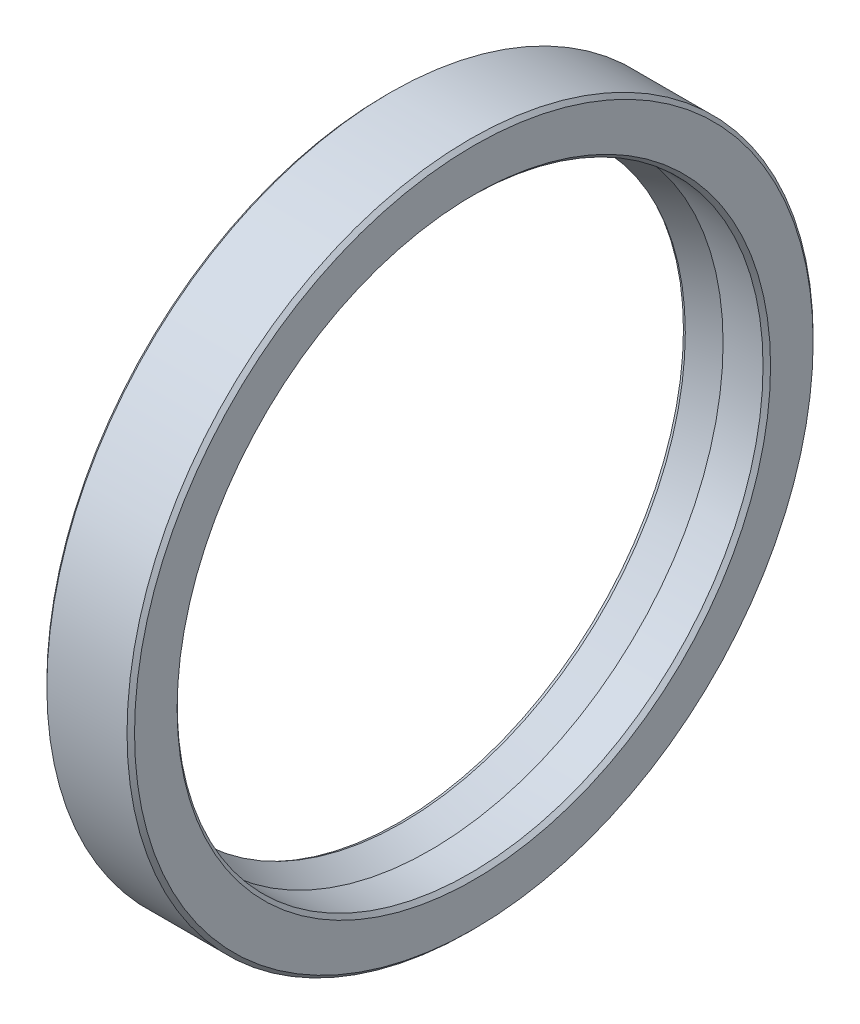
ISO-10303-21;
HEADER;
FILE_DESCRIPTION(('STEP AP214'),'2;1');
FILE_NAME('part.step','',(''),(''),'','','');
FILE_SCHEMA(('AUTOMOTIVE_DESIGN { 1 0 10303 214 1 1 1 1 }'));
ENDSEC;
DATA;
#1=APPLICATION_CONTEXT('core data for automotive mechanical design processes');
#2=APPLICATION_PROTOCOL_DEFINITION('international standard','automotive_design',2000,#1);
#3=PRODUCT_CONTEXT('',#1,'mechanical');
#4=PRODUCT('Part','Part','',(#3));
#5=PRODUCT_RELATED_PRODUCT_CATEGORY('part','',(#4));
#6=PRODUCT_DEFINITION_FORMATION('','',#4);
#7=PRODUCT_DEFINITION_CONTEXT('part definition',#1,'design');
#8=PRODUCT_DEFINITION('design','',#6,#7);
#9=PRODUCT_DEFINITION_SHAPE('','',#8);
#10=(LENGTH_UNIT() NAMED_UNIT(*) SI_UNIT(.MILLI.,.METRE.));
#11=(NAMED_UNIT(*) PLANE_ANGLE_UNIT() SI_UNIT($,.RADIAN.));
#12=(NAMED_UNIT(*) SI_UNIT($,.STERADIAN.) SOLID_ANGLE_UNIT());
#13=UNCERTAINTY_MEASURE_WITH_UNIT(LENGTH_MEASURE(1.E-05),#10,'distance_accuracy_value','');
#14=(GEOMETRIC_REPRESENTATION_CONTEXT(3) GLOBAL_UNCERTAINTY_ASSIGNED_CONTEXT((#13)) GLOBAL_UNIT_ASSIGNED_CONTEXT((#10,
#11,#12)) REPRESENTATION_CONTEXT('',''));
#15=CARTESIAN_POINT('',(0.,0.,0.));
#16=DIRECTION('',(0.,0.,1.));
#17=DIRECTION('',(1.,0.,0.));
#18=AXIS2_PLACEMENT_3D('',#15,#16,#17);
#19=CARTESIAN_POINT('',(4.,-27.3897415989074,0.));
#20=DIRECTION('',(1.,0.,0.));
#21=DIRECTION('',(0.,0.,-1.));
#22=AXIS2_PLACEMENT_3D('',#19,#20,#21);
#23=TOROIDAL_SURFACE('',#22,25.3897415989074,0.75);
#24=CARTESIAN_POINT('',(4.27711738402882,-27.3897415989074,0.));
#25=DIRECTION('',(1.,0.,0.));
#26=DIRECTION('',(0.,0.,-1.));
#27=AXIS2_PLACEMENT_3D('',#24,#25,#26);
#28=CIRCLE('',#27,24.6928155228641);
#29=CARTESIAN_POINT('',(4.27711738402882,-27.3897415989074,-24.6928155228641));
#30=VERTEX_POINT('',#29);
#31=EDGE_CURVE('E10',#30,#30,#28,.T.);
#32=ORIENTED_EDGE('',*,*,#31,.T.);
#33=EDGE_LOOP('',(#32));
#34=FACE_BOUND('',#33,.T.);
#35=CARTESIAN_POINT('',(4.04651405963486,-27.3897415989074,0.));
#36=DIRECTION('',(1.,0.,0.));
#37=DIRECTION('',(0.,0.,-1.));
#38=AXIS2_PLACEMENT_3D('',#35,#36,#37);
#39=CIRCLE('',#38,26.1382978374468);
#40=CARTESIAN_POINT('',(4.04651405963486,-27.3897415989074,-26.1382978374468));
#41=VERTEX_POINT('',#40);
#42=EDGE_CURVE('E85',#41,#41,#39,.T.);
#43=ORIENTED_EDGE('',*,*,#42,.F.);
#44=EDGE_LOOP('',(#43));
#45=FACE_BOUND('',#44,.T.);
#46=ADVANCED_FACE('F39',(#34,#45),#23,.F.);
#47=CARTESIAN_POINT('',(4.27711738402882,-27.3897415989074,0.));
#48=DIRECTION('',(1.,0.,0.));
#49=DIRECTION('',(0.,0.,-1.));
#50=AXIS2_PLACEMENT_3D('',#47,#48,#49);
#51=CONICAL_SURFACE('',#50,24.6928155228641,0.378459955629821);
#52=CARTESIAN_POINT('',(1.31525507731412,-27.3897415989074,0.));
#53=DIRECTION('',(1.,0.,0.));
#54=DIRECTION('',(0.,0.,-1.));
#55=AXIS2_PLACEMENT_3D('',#52,#53,#54);
#56=CIRCLE('',#55,23.5150958729548);
#57=CARTESIAN_POINT('',(1.31525507731412,-27.3897415989074,-23.5150958729548));
#58=VERTEX_POINT('',#57);
#59=EDGE_CURVE('E45',#58,#58,#56,.T.);
#60=ORIENTED_EDGE('',*,*,#59,.T.);
#61=EDGE_LOOP('',(#60));
#62=FACE_BOUND('',#61,.T.);
#63=ORIENTED_EDGE('',*,*,#31,.F.);
#64=EDGE_LOOP('',(#63));
#65=FACE_BOUND('',#64,.T.);
#66=ADVANCED_FACE('F93',(#62,#65),#51,.T.);
#67=CARTESIAN_POINT('',(1.5,-27.3897415989074,0.));
#68=DIRECTION('',(1.,0.,0.));
#69=DIRECTION('',(0.,0.,-1.));
#70=AXIS2_PLACEMENT_3D('',#67,#68,#69);
#71=TOROIDAL_SURFACE('',#70,23.0504784889259,0.5);
#72=CARTESIAN_POINT('',(1.,-27.3897415989074,0.));
#73=DIRECTION('',(1.,0.,0.));
#74=DIRECTION('',(0.,0.,-1.));
#75=AXIS2_PLACEMENT_3D('',#72,#73,#74);
#76=CIRCLE('',#75,23.0504784889259);
#77=CARTESIAN_POINT('',(1.,-27.3897415989074,-23.0504784889259));
#78=VERTEX_POINT('',#77);
#79=EDGE_CURVE('E49',#78,#78,#76,.T.);
#80=ORIENTED_EDGE('',*,*,#79,.T.);
#81=EDGE_LOOP('',(#80));
#82=FACE_BOUND('',#81,.T.);
#83=ORIENTED_EDGE('',*,*,#59,.F.);
#84=EDGE_LOOP('',(#83));
#85=FACE_BOUND('',#84,.T.);
#86=ADVANCED_FACE('F97',(#82,#85),#71,.T.);
#87=CARTESIAN_POINT('',(1.,-4.33926310998144,0.));
#88=DIRECTION('',(-1.,0.,0.));
#89=DIRECTION('',(0.,0.,1.));
#90=AXIS2_PLACEMENT_3D('',#87,#88,#89);
#91=PLANE('',#90);
#92=CARTESIAN_POINT('',(1.,-27.3897415989074,0.));
#93=DIRECTION('',(1.,0.,0.));
#94=DIRECTION('',(0.,0.,-1.));
#95=AXIS2_PLACEMENT_3D('',#92,#93,#94);
#96=CIRCLE('',#95,22.7347226406222);
#97=CARTESIAN_POINT('',(1.,-27.3897415989074,-22.7347226406222));
#98=VERTEX_POINT('',#97);
#99=EDGE_CURVE('E53',#98,#98,#96,.T.);
#100=ORIENTED_EDGE('',*,*,#99,.T.);
#101=EDGE_LOOP('',(#100));
#102=FACE_BOUND('',#101,.T.);
#103=ORIENTED_EDGE('',*,*,#79,.F.);
#104=EDGE_LOOP('',(#103));
#105=FACE_BOUND('',#104,.T.);
#106=ADVANCED_FACE('F101',(#102,#105),#91,.T.);
#107=CARTESIAN_POINT('',(1.,-27.3897415989074,0.));
#108=DIRECTION('',(-1.,0.,0.));
#109=DIRECTION('',(0.,0.,1.));
#110=AXIS2_PLACEMENT_3D('',#107,#108,#109);
#111=CONICAL_SURFACE('',#110,22.7347226406222,0.444647520399419);
#112=CARTESIAN_POINT('',(1.28275122105899,-27.3897415989074,0.));
#113=DIRECTION('',(1.,0.,0.));
#114=DIRECTION('',(0.,0.,-1.));
#115=AXIS2_PLACEMENT_3D('',#112,#113,#114);
#116=CIRCLE('',#115,22.6);
#117=CARTESIAN_POINT('',(1.28275122105899,-27.3897415989074,-22.6));
#118=VERTEX_POINT('',#117);
#119=EDGE_CURVE('E58',#118,#118,#116,.T.);
#120=ORIENTED_EDGE('',*,*,#119,.T.);
#121=EDGE_LOOP('',(#120));
#122=FACE_BOUND('',#121,.T.);
#123=ORIENTED_EDGE('',*,*,#99,.F.);
#124=EDGE_LOOP('',(#123));
#125=FACE_BOUND('',#124,.T.);
#126=ADVANCED_FACE('F108',(#122,#125),#111,.F.);
#127=CARTESIAN_POINT('',(1.28275122105899,-27.3897415989074,0.));
#128=DIRECTION('',(1.,0.,0.));
#129=DIRECTION('',(0.,0.,-1.));
#130=AXIS2_PLACEMENT_3D('',#127,#128,#129);
#131=CONICAL_SURFACE('',#130,22.6,0.340750642998034);
#132=CARTESIAN_POINT('',(3.51,-27.3897415989074,0.));
#133=DIRECTION('',(1.,0.,0.));
#134=DIRECTION('',(0.,0.,-1.));
#135=AXIS2_PLACEMENT_3D('',#132,#133,#134);
#136=CIRCLE('',#135,23.3897415989074);
#137=CARTESIAN_POINT('',(3.51,-27.3897415989074,-23.3897415989074));
#138=VERTEX_POINT('',#137);
#139=EDGE_CURVE('E61',#138,#138,#136,.T.);
#140=ORIENTED_EDGE('',*,*,#139,.T.);
#141=EDGE_LOOP('',(#140));
#142=FACE_BOUND('',#141,.T.);
#143=ORIENTED_EDGE('',*,*,#119,.F.);
#144=EDGE_LOOP('',(#143));
#145=FACE_BOUND('',#144,.T.);
#146=ADVANCED_FACE('F112',(#142,#145),#131,.F.);
#147=CARTESIAN_POINT('',(1.28275122105899,-27.3897415989074,0.));
#148=DIRECTION('',(1.,0.,0.));
#149=DIRECTION('',(0.,0.,-1.));
#150=AXIS2_PLACEMENT_3D('',#147,#148,#149);
#151=CYLINDRICAL_SURFACE('',#150,23.3897415989074);
#152=CARTESIAN_POINT('',(6.7,-27.3897415989074,0.));
#153=DIRECTION('',(1.,0.,0.));
#154=DIRECTION('',(0.,0.,-1.));
#155=AXIS2_PLACEMENT_3D('',#152,#153,#154);
#156=CIRCLE('',#155,23.3897415989074);
#157=CARTESIAN_POINT('',(6.7,-27.3897415989074,-23.3897415989074));
#158=VERTEX_POINT('',#157);
#159=EDGE_CURVE('E64',#158,#158,#156,.T.);
#160=ORIENTED_EDGE('',*,*,#159,.T.);
#161=EDGE_LOOP('',(#160));
#162=FACE_BOUND('',#161,.T.);
#163=ORIENTED_EDGE('',*,*,#139,.F.);
#164=EDGE_LOOP('',(#163));
#165=FACE_BOUND('',#164,.T.);
#166=ADVANCED_FACE('F116',(#162,#165),#151,.F.);
#167=CARTESIAN_POINT('',(6.7,-27.3897415989074,0.));
#168=DIRECTION('',(1.,0.,0.));
#169=DIRECTION('',(0.,0.,-1.));
#170=AXIS2_PLACEMENT_3D('',#167,#168,#169);
#171=CONICAL_SURFACE('',#170,23.3897415989074,0.785398163397451);
#172=CARTESIAN_POINT('',(7.,-27.3897415989074,0.));
#173=DIRECTION('',(1.,0.,0.));
#174=DIRECTION('',(0.,0.,-1.));
#175=AXIS2_PLACEMENT_3D('',#172,#173,#174);
#176=CIRCLE('',#175,23.6897415989074);
#177=CARTESIAN_POINT('',(7.,-27.3897415989074,-23.6897415989074));
#178=VERTEX_POINT('',#177);
#179=EDGE_CURVE('E67',#178,#178,#176,.T.);
#180=ORIENTED_EDGE('',*,*,#179,.T.);
#181=EDGE_LOOP('',(#180));
#182=FACE_BOUND('',#181,.T.);
#183=ORIENTED_EDGE('',*,*,#159,.F.);
#184=EDGE_LOOP('',(#183));
#185=FACE_BOUND('',#184,.T.);
#186=ADVANCED_FACE('F120',(#182,#185),#171,.F.);
#187=CARTESIAN_POINT('',(7.,-0.299999999999999,0.));
#188=DIRECTION('',(1.,0.,0.));
#189=DIRECTION('',(0.,0.,-1.));
#190=AXIS2_PLACEMENT_3D('',#187,#188,#189);
#191=PLANE('',#190);
#192=CARTESIAN_POINT('',(7.,-27.3897415989074,0.));
#193=DIRECTION('',(1.,0.,0.));
#194=DIRECTION('',(0.,0.,-1.));
#195=AXIS2_PLACEMENT_3D('',#192,#193,#194);
#196=CIRCLE('',#195,27.0897415989074);
#197=CARTESIAN_POINT('',(7.,-27.3897415989074,-27.0897415989074));
#198=VERTEX_POINT('',#197);
#199=EDGE_CURVE('E70',#198,#198,#196,.T.);
#200=ORIENTED_EDGE('',*,*,#199,.T.);
#201=EDGE_LOOP('',(#200));
#202=FACE_BOUND('',#201,.T.);
#203=ORIENTED_EDGE('',*,*,#179,.F.);
#204=EDGE_LOOP('',(#203));
#205=FACE_BOUND('',#204,.T.);
#206=ADVANCED_FACE('F124',(#202,#205),#191,.T.);
#207=CARTESIAN_POINT('',(7.,-27.3897415989074,0.));
#208=DIRECTION('',(-1.,0.,0.));
#209=DIRECTION('',(0.,0.,1.));
#210=AXIS2_PLACEMENT_3D('',#207,#208,#209);
#211=CONICAL_SURFACE('',#210,27.0897415989074,0.785398163397445);
#212=CARTESIAN_POINT('',(6.7,-27.3897415989074,0.));
#213=DIRECTION('',(1.,0.,0.));
#214=DIRECTION('',(0.,0.,-1.));
#215=AXIS2_PLACEMENT_3D('',#212,#213,#214);
#216=CIRCLE('',#215,27.3897415989074);
#217=CARTESIAN_POINT('',(6.7,-27.3897415989074,-27.3897415989074));
#218=VERTEX_POINT('',#217);
#219=EDGE_CURVE('E73',#218,#218,#216,.T.);
#220=ORIENTED_EDGE('',*,*,#219,.T.);
#221=EDGE_LOOP('',(#220));
#222=FACE_BOUND('',#221,.T.);
#223=ORIENTED_EDGE('',*,*,#199,.F.);
#224=EDGE_LOOP('',(#223));
#225=FACE_BOUND('',#224,.T.);
#226=ADVANCED_FACE('F128',(#222,#225),#211,.T.);
#227=CARTESIAN_POINT('',(1.28275122105899,-27.3897415989074,0.));
#228=DIRECTION('',(1.,0.,0.));
#229=DIRECTION('',(0.,0.,-1.));
#230=AXIS2_PLACEMENT_3D('',#227,#228,#229);
#231=CYLINDRICAL_SURFACE('',#230,27.3897415989074);
#232=CARTESIAN_POINT('',(0.3,-27.3897415989074,0.));
#233=DIRECTION('',(1.,0.,0.));
#234=DIRECTION('',(0.,0.,-1.));
#235=AXIS2_PLACEMENT_3D('',#232,#233,#234);
#236=CIRCLE('',#235,27.3897415989074);
#237=CARTESIAN_POINT('',(0.3,-27.3897415989074,-27.3897415989074));
#238=VERTEX_POINT('',#237);
#239=EDGE_CURVE('E76',#238,#238,#236,.T.);
#240=ORIENTED_EDGE('',*,*,#239,.T.);
#241=EDGE_LOOP('',(#240));
#242=FACE_BOUND('',#241,.T.);
#243=ORIENTED_EDGE('',*,*,#219,.F.);
#244=EDGE_LOOP('',(#243));
#245=FACE_BOUND('',#244,.T.);
#246=ADVANCED_FACE('F132',(#242,#245),#231,.T.);
#247=CARTESIAN_POINT('',(0.3,-27.3897415989074,0.));
#248=DIRECTION('',(1.,0.,0.));
#249=DIRECTION('',(0.,0.,-1.));
#250=AXIS2_PLACEMENT_3D('',#247,#248,#249);
#251=CONICAL_SURFACE('',#250,27.3897415989074,0.785398163397445);
#252=CARTESIAN_POINT('',(0.,-27.3897415989074,0.));
#253=DIRECTION('',(1.,0.,0.));
#254=DIRECTION('',(0.,0.,-1.));
#255=AXIS2_PLACEMENT_3D('',#252,#253,#254);
#256=CIRCLE('',#255,27.0897415989074);
#257=CARTESIAN_POINT('',(0.,-27.3897415989074,-27.0897415989074));
#258=VERTEX_POINT('',#257);
#259=EDGE_CURVE('E79',#258,#258,#256,.T.);
#260=ORIENTED_EDGE('',*,*,#259,.T.);
#261=EDGE_LOOP('',(#260));
#262=FACE_BOUND('',#261,.T.);
#263=ORIENTED_EDGE('',*,*,#239,.F.);
#264=EDGE_LOOP('',(#263));
#265=FACE_BOUND('',#264,.T.);
#266=ADVANCED_FACE('F136',(#262,#265),#251,.T.);
#267=CARTESIAN_POINT('',(0.,-0.299999999999999,0.));
#268=DIRECTION('',(-1.,0.,0.));
#269=DIRECTION('',(0.,0.,1.));
#270=AXIS2_PLACEMENT_3D('',#267,#268,#269);
#271=PLANE('',#270);
#272=CARTESIAN_POINT('',(0.,-27.3897415989074,0.));
#273=DIRECTION('',(1.,0.,0.));
#274=DIRECTION('',(0.,0.,-1.));
#275=AXIS2_PLACEMENT_3D('',#272,#273,#274);
#276=CIRCLE('',#275,26.3897415989074);
#277=CARTESIAN_POINT('',(0.,-27.3897415989074,-26.3897415989074));
#278=VERTEX_POINT('',#277);
#279=EDGE_CURVE('E82',#278,#278,#276,.T.);
#280=ORIENTED_EDGE('',*,*,#279,.T.);
#281=EDGE_LOOP('',(#280));
#282=FACE_BOUND('',#281,.T.);
#283=ORIENTED_EDGE('',*,*,#259,.F.);
#284=EDGE_LOOP('',(#283));
#285=FACE_BOUND('',#284,.T.);
#286=ADVANCED_FACE('F140',(#282,#285),#271,.T.);
#287=CARTESIAN_POINT('',(0.,-27.3897415989074,0.));
#288=DIRECTION('',(-1.,0.,0.));
#289=DIRECTION('',(0.,0.,1.));
#290=AXIS2_PLACEMENT_3D('',#287,#288,#289);
#291=CONICAL_SURFACE('',#290,26.3897415989074,0.0620585725260542);
#292=ORIENTED_EDGE('',*,*,#42,.T.);
#293=EDGE_LOOP('',(#292));
#294=FACE_BOUND('',#293,.T.);
#295=ORIENTED_EDGE('',*,*,#279,.F.);
#296=EDGE_LOOP('',(#295));
#297=FACE_BOUND('',#296,.T.);
#298=ADVANCED_FACE('F89',(#294,#297),#291,.F.);
#299=CLOSED_SHELL('',(#46,#66,#86,#106,#126,#146,#166,#186,#206,#226,#246,#266,#286,#298));
#300=MANIFOLD_SOLID_BREP('B2',#299);
#301=ADVANCED_BREP_SHAPE_REPRESENTATION('',(#18,#300),#14);
#302=SHAPE_DEFINITION_REPRESENTATION(#9,#301);
ENDSEC;
END-ISO-10303-21;
